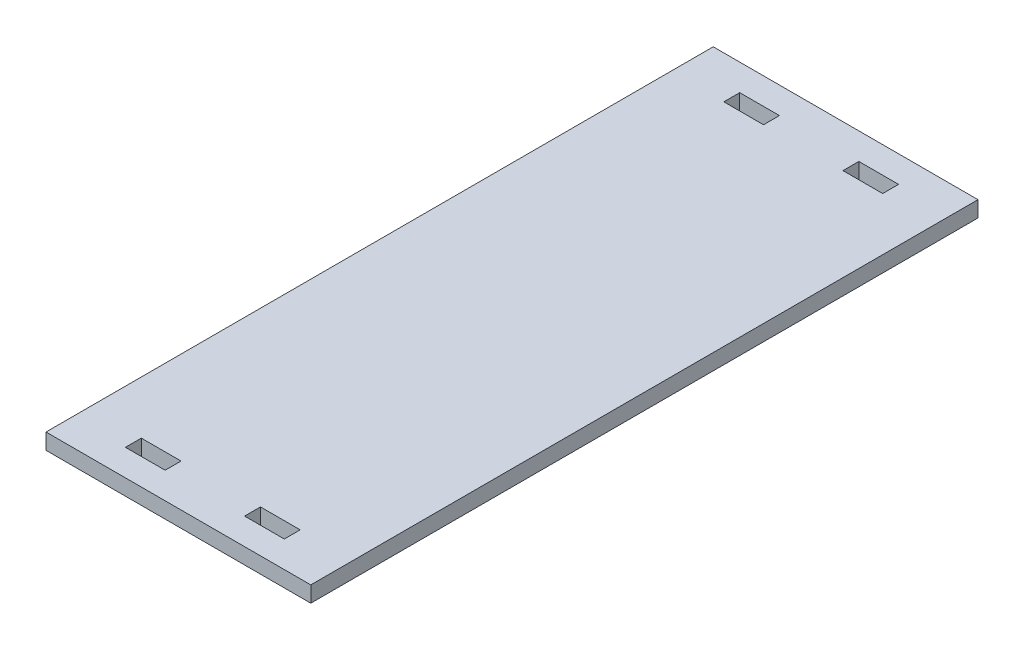
ISO-10303-21;
HEADER;
FILE_DESCRIPTION(('STEP AP214'),'2;1');
FILE_NAME('part.step','',(''),(''),'','','');
FILE_SCHEMA(('AUTOMOTIVE_DESIGN { 1 0 10303 214 1 1 1 1 }'));
ENDSEC;
DATA;
#1=APPLICATION_CONTEXT('core data for automotive mechanical design processes');
#2=APPLICATION_PROTOCOL_DEFINITION('international standard','automotive_design',2000,#1);
#3=PRODUCT_CONTEXT('',#1,'mechanical');
#4=PRODUCT('Part','Part','',(#3));
#5=PRODUCT_RELATED_PRODUCT_CATEGORY('part','',(#4));
#6=PRODUCT_DEFINITION_FORMATION('','',#4);
#7=PRODUCT_DEFINITION_CONTEXT('part definition',#1,'design');
#8=PRODUCT_DEFINITION('design','',#6,#7);
#9=PRODUCT_DEFINITION_SHAPE('','',#8);
#10=(LENGTH_UNIT() NAMED_UNIT(*) SI_UNIT(.MILLI.,.METRE.));
#11=(NAMED_UNIT(*) PLANE_ANGLE_UNIT() SI_UNIT($,.RADIAN.));
#12=(NAMED_UNIT(*) SI_UNIT($,.STERADIAN.) SOLID_ANGLE_UNIT());
#13=UNCERTAINTY_MEASURE_WITH_UNIT(LENGTH_MEASURE(1.E-05),#10,'distance_accuracy_value','');
#14=(GEOMETRIC_REPRESENTATION_CONTEXT(3) GLOBAL_UNCERTAINTY_ASSIGNED_CONTEXT((#13)) GLOBAL_UNIT_ASSIGNED_CONTEXT((#10,
#11,#12)) REPRESENTATION_CONTEXT('',''));
#15=CARTESIAN_POINT('',(0.,0.,0.));
#16=DIRECTION('',(0.,0.,1.));
#17=DIRECTION('',(1.,0.,0.));
#18=AXIS2_PLACEMENT_3D('',#15,#16,#17);
#19=CARTESIAN_POINT('',(0.,6.,0.));
#20=DIRECTION('',(0.,1.,0.));
#21=DIRECTION('',(0.,0.,1.));
#22=AXIS2_PLACEMENT_3D('',#19,#20,#21);
#23=PLANE('',#22);
#24=DIRECTION('',(0.,0.,-1.));
#25=VECTOR('',#24,1.);
#26=CARTESIAN_POINT('',(0.,6.,252.));
#27=LINE('',#26,#25);
#28=CARTESIAN_POINT('',(0.,6.,252.));
#29=VERTEX_POINT('',#28);
#30=CARTESIAN_POINT('',(0.,6.,0.));
#31=VERTEX_POINT('',#30);
#32=EDGE_CURVE('E360',#29,#31,#27,.T.);
#33=ORIENTED_EDGE('',*,*,#32,.T.);
#34=DIRECTION('',(-1.,0.,0.));
#35=VECTOR('',#34,1.);
#36=CARTESIAN_POINT('',(0.,6.,0.));
#37=LINE('',#36,#35);
#38=CARTESIAN_POINT('',(-100.,6.,0.));
#39=VERTEX_POINT('',#38);
#40=EDGE_CURVE('E364',#31,#39,#37,.T.);
#41=ORIENTED_EDGE('',*,*,#40,.T.);
#42=DIRECTION('',(0.,0.,1.));
#43=VECTOR('',#42,1.);
#44=CARTESIAN_POINT('',(-100.,6.,0.));
#45=LINE('',#44,#43);
#46=CARTESIAN_POINT('',(-100.,6.,252.));
#47=VERTEX_POINT('',#46);
#48=EDGE_CURVE('E368',#39,#47,#45,.T.);
#49=ORIENTED_EDGE('',*,*,#48,.T.);
#50=DIRECTION('',(1.,0.,0.));
#51=VECTOR('',#50,1.);
#52=CARTESIAN_POINT('',(-100.,6.,252.));
#53=LINE('',#52,#51);
#54=EDGE_CURVE('E371',#47,#29,#53,.T.);
#55=ORIENTED_EDGE('',*,*,#54,.T.);
#56=EDGE_LOOP('',(#33,#41,#49,#55));
#57=FACE_BOUND('',#56,.T.);
#58=DIRECTION('',(0.,0.,1.));
#59=VECTOR('',#58,1.);
#60=CARTESIAN_POINT('',(-80.,6.,10.));
#61=LINE('',#60,#59);
#62=CARTESIAN_POINT('',(-80.,6.,10.));
#63=VERTEX_POINT('',#62);
#64=CARTESIAN_POINT('',(-80.,6.,16.));
#65=VERTEX_POINT('',#64);
#66=EDGE_CURVE('E320',#63,#65,#61,.T.);
#67=ORIENTED_EDGE('',*,*,#66,.F.);
#68=DIRECTION('',(-1.,0.,0.));
#69=VECTOR('',#68,1.);
#70=CARTESIAN_POINT('',(-65.,6.,10.));
#71=LINE('',#70,#69);
#72=CARTESIAN_POINT('',(-65.,6.,10.));
#73=VERTEX_POINT('',#72);
#74=EDGE_CURVE('E317',#73,#63,#71,.T.);
#75=ORIENTED_EDGE('',*,*,#74,.F.);
#76=DIRECTION('',(0.,0.,-1.));
#77=VECTOR('',#76,1.);
#78=CARTESIAN_POINT('',(-65.,6.,10.));
#79=LINE('',#78,#77);
#80=CARTESIAN_POINT('',(-65.,6.,16.));
#81=VERTEX_POINT('',#80);
#82=EDGE_CURVE('E328',#81,#73,#79,.T.);
#83=ORIENTED_EDGE('',*,*,#82,.F.);
#84=DIRECTION('',(1.,0.,0.));
#85=VECTOR('',#84,1.);
#86=CARTESIAN_POINT('',(-80.,6.,16.));
#87=LINE('',#86,#85);
#88=EDGE_CURVE('E324',#65,#81,#87,.T.);
#89=ORIENTED_EDGE('',*,*,#88,.F.);
#90=EDGE_LOOP('',(#67,#75,#83,#89));
#91=FACE_BOUND('',#90,.T.);
#92=DIRECTION('',(0.,0.,-1.));
#93=VECTOR('',#92,1.);
#94=CARTESIAN_POINT('',(-20.,6.,10.));
#95=LINE('',#94,#93);
#96=CARTESIAN_POINT('',(-20.,6.,16.));
#97=VERTEX_POINT('',#96);
#98=CARTESIAN_POINT('',(-20.,6.,10.));
#99=VERTEX_POINT('',#98);
#100=EDGE_CURVE('E277',#97,#99,#95,.T.);
#101=ORIENTED_EDGE('',*,*,#100,.F.);
#102=DIRECTION('',(1.,0.,0.));
#103=VECTOR('',#102,1.);
#104=CARTESIAN_POINT('',(-20.,6.,16.));
#105=LINE('',#104,#103);
#106=CARTESIAN_POINT('',(-35.,6.,16.));
#107=VERTEX_POINT('',#106);
#108=EDGE_CURVE('E274',#107,#97,#105,.T.);
#109=ORIENTED_EDGE('',*,*,#108,.F.);
#110=DIRECTION('',(0.,0.,1.));
#111=VECTOR('',#110,1.);
#112=CARTESIAN_POINT('',(-35.,6.,16.));
#113=LINE('',#112,#111);
#114=CARTESIAN_POINT('',(-35.,6.,10.));
#115=VERTEX_POINT('',#114);
#116=EDGE_CURVE('E285',#115,#107,#113,.T.);
#117=ORIENTED_EDGE('',*,*,#116,.F.);
#118=DIRECTION('',(-1.,0.,0.));
#119=VECTOR('',#118,1.);
#120=CARTESIAN_POINT('',(-35.,6.,10.));
#121=LINE('',#120,#119);
#122=EDGE_CURVE('E281',#99,#115,#121,.T.);
#123=ORIENTED_EDGE('',*,*,#122,.F.);
#124=EDGE_LOOP('',(#101,#109,#117,#123));
#125=FACE_BOUND('',#124,.T.);
#126=DIRECTION('',(1.,0.,0.));
#127=VECTOR('',#126,1.);
#128=CARTESIAN_POINT('',(-80.,6.,242.000000000012));
#129=LINE('',#128,#127);
#130=CARTESIAN_POINT('',(-80.,6.,242.000000000012));
#131=VERTEX_POINT('',#130);
#132=CARTESIAN_POINT('',(-65.,6.,242.000000000012));
#133=VERTEX_POINT('',#132);
#134=EDGE_CURVE('E234',#131,#133,#129,.T.);
#135=ORIENTED_EDGE('',*,*,#134,.F.);
#136=DIRECTION('',(0.,0.,1.));
#137=VECTOR('',#136,1.);
#138=CARTESIAN_POINT('',(-80.,6.,236.000000000012));
#139=LINE('',#138,#137);
#140=CARTESIAN_POINT('',(-80.,6.,236.000000000012));
#141=VERTEX_POINT('',#140);
#142=EDGE_CURVE('E231',#141,#131,#139,.T.);
#143=ORIENTED_EDGE('',*,*,#142,.F.);
#144=DIRECTION('',(-1.,0.,0.));
#145=VECTOR('',#144,1.);
#146=CARTESIAN_POINT('',(-65.,6.,236.000000000012));
#147=LINE('',#146,#145);
#148=CARTESIAN_POINT('',(-65.,6.,236.000000000012));
#149=VERTEX_POINT('',#148);
#150=EDGE_CURVE('E242',#149,#141,#147,.T.);
#151=ORIENTED_EDGE('',*,*,#150,.F.);
#152=DIRECTION('',(0.,0.,-1.));
#153=VECTOR('',#152,1.);
#154=CARTESIAN_POINT('',(-65.,6.,236.000000000012));
#155=LINE('',#154,#153);
#156=EDGE_CURVE('E238',#133,#149,#155,.T.);
#157=ORIENTED_EDGE('',*,*,#156,.F.);
#158=EDGE_LOOP('',(#135,#143,#151,#157));
#159=FACE_BOUND('',#158,.T.);
#160=DIRECTION('',(0.,0.,-1.));
#161=VECTOR('',#160,1.);
#162=CARTESIAN_POINT('',(-20.,6.,236.000000000012));
#163=LINE('',#162,#161);
#164=CARTESIAN_POINT('',(-20.,6.,242.000000000012));
#165=VERTEX_POINT('',#164);
#166=CARTESIAN_POINT('',(-20.,6.,236.000000000012));
#167=VERTEX_POINT('',#166);
#168=EDGE_CURVE('E192',#165,#167,#163,.T.);
#169=ORIENTED_EDGE('',*,*,#168,.F.);
#170=DIRECTION('',(1.,0.,0.));
#171=VECTOR('',#170,1.);
#172=CARTESIAN_POINT('',(-20.,6.,242.000000000012));
#173=LINE('',#172,#171);
#174=CARTESIAN_POINT('',(-35.,6.,242.000000000012));
#175=VERTEX_POINT('',#174);
#176=EDGE_CURVE('E183',#175,#165,#173,.T.);
#177=ORIENTED_EDGE('',*,*,#176,.F.);
#178=DIRECTION('',(0.,0.,1.));
#179=VECTOR('',#178,1.);
#180=CARTESIAN_POINT('',(-35.,6.,242.000000000012));
#181=LINE('',#180,#179);
#182=CARTESIAN_POINT('',(-35.,6.,236.000000000012));
#183=VERTEX_POINT('',#182);
#184=EDGE_CURVE('E209',#183,#175,#181,.T.);
#185=ORIENTED_EDGE('',*,*,#184,.F.);
#186=DIRECTION('',(-1.,0.,0.));
#187=VECTOR('',#186,1.);
#188=CARTESIAN_POINT('',(-35.,6.,236.000000000012));
#189=LINE('',#188,#187);
#190=EDGE_CURVE('E205',#167,#183,#189,.T.);
#191=ORIENTED_EDGE('',*,*,#190,.F.);
#192=EDGE_LOOP('',(#169,#177,#185,#191));
#193=FACE_BOUND('',#192,.T.);
#194=ADVANCED_FACE('F45',(#57,#91,#125,#159,#193),#23,.T.);
#195=CARTESIAN_POINT('',(0.,0.,0.));
#196=DIRECTION('',(0.,1.,0.));
#197=DIRECTION('',(0.,0.,1.));
#198=AXIS2_PLACEMENT_3D('',#195,#196,#197);
#199=PLANE('',#198);
#200=DIRECTION('',(0.,0.,1.));
#201=VECTOR('',#200,1.);
#202=CARTESIAN_POINT('',(-80.,0.,236.000000000012));
#203=LINE('',#202,#201);
#204=CARTESIAN_POINT('',(-80.,0.,236.000000000012));
#205=VERTEX_POINT('',#204);
#206=CARTESIAN_POINT('',(-80.,0.,242.000000000012));
#207=VERTEX_POINT('',#206);
#208=EDGE_CURVE('E201',#205,#207,#203,.T.);
#209=ORIENTED_EDGE('',*,*,#208,.T.);
#210=DIRECTION('',(1.,0.,0.));
#211=VECTOR('',#210,1.);
#212=CARTESIAN_POINT('',(-80.,0.,242.000000000012));
#213=LINE('',#212,#211);
#214=CARTESIAN_POINT('',(-65.,0.,242.000000000012));
#215=VERTEX_POINT('',#214);
#216=EDGE_CURVE('E249',#207,#215,#213,.T.);
#217=ORIENTED_EDGE('',*,*,#216,.T.);
#218=DIRECTION('',(0.,0.,-1.));
#219=VECTOR('',#218,1.);
#220=CARTESIAN_POINT('',(-65.,0.,236.000000000012));
#221=LINE('',#220,#219);
#222=CARTESIAN_POINT('',(-65.,0.,236.000000000012));
#223=VERTEX_POINT('',#222);
#224=EDGE_CURVE('E253',#215,#223,#221,.T.);
#225=ORIENTED_EDGE('',*,*,#224,.T.);
#226=DIRECTION('',(-1.,0.,0.));
#227=VECTOR('',#226,1.);
#228=CARTESIAN_POINT('',(-65.,0.,236.000000000012));
#229=LINE('',#228,#227);
#230=EDGE_CURVE('E235',#223,#205,#229,.T.);
#231=ORIENTED_EDGE('',*,*,#230,.T.);
#232=EDGE_LOOP('',(#209,#217,#225,#231));
#233=FACE_BOUND('',#232,.T.);
#234=DIRECTION('',(-1.,0.,0.));
#235=VECTOR('',#234,1.);
#236=CARTESIAN_POINT('',(-65.,0.,10.));
#237=LINE('',#236,#235);
#238=CARTESIAN_POINT('',(-65.,0.,10.));
#239=VERTEX_POINT('',#238);
#240=CARTESIAN_POINT('',(-80.,0.,10.));
#241=VERTEX_POINT('',#240);
#242=EDGE_CURVE('E316',#239,#241,#237,.T.);
#243=ORIENTED_EDGE('',*,*,#242,.T.);
#244=DIRECTION('',(0.,0.,1.));
#245=VECTOR('',#244,1.);
#246=CARTESIAN_POINT('',(-80.,0.,10.));
#247=LINE('',#246,#245);
#248=CARTESIAN_POINT('',(-80.,0.,16.));
#249=VERTEX_POINT('',#248);
#250=EDGE_CURVE('E335',#241,#249,#247,.T.);
#251=ORIENTED_EDGE('',*,*,#250,.T.);
#252=DIRECTION('',(1.,0.,0.));
#253=VECTOR('',#252,1.);
#254=CARTESIAN_POINT('',(-80.,0.,16.));
#255=LINE('',#254,#253);
#256=CARTESIAN_POINT('',(-65.,0.,16.));
#257=VERTEX_POINT('',#256);
#258=EDGE_CURVE('E339',#249,#257,#255,.T.);
#259=ORIENTED_EDGE('',*,*,#258,.T.);
#260=DIRECTION('',(0.,0.,-1.));
#261=VECTOR('',#260,1.);
#262=CARTESIAN_POINT('',(-65.,0.,10.));
#263=LINE('',#262,#261);
#264=EDGE_CURVE('E321',#257,#239,#263,.T.);
#265=ORIENTED_EDGE('',*,*,#264,.T.);
#266=EDGE_LOOP('',(#243,#251,#259,#265));
#267=FACE_BOUND('',#266,.T.);
#268=DIRECTION('',(0.,0.,-1.));
#269=VECTOR('',#268,1.);
#270=CARTESIAN_POINT('',(0.,0.,252.));
#271=LINE('',#270,#269);
#272=CARTESIAN_POINT('',(0.,0.,252.));
#273=VERTEX_POINT('',#272);
#274=CARTESIAN_POINT('',(0.,0.,0.));
#275=VERTEX_POINT('',#274);
#276=EDGE_CURVE('E359',#273,#275,#271,.T.);
#277=ORIENTED_EDGE('',*,*,#276,.F.);
#278=DIRECTION('',(1.,0.,0.));
#279=VECTOR('',#278,1.);
#280=CARTESIAN_POINT('',(-100.,0.,252.));
#281=LINE('',#280,#279);
#282=CARTESIAN_POINT('',(-100.,0.,252.));
#283=VERTEX_POINT('',#282);
#284=EDGE_CURVE('E365',#283,#273,#281,.T.);
#285=ORIENTED_EDGE('',*,*,#284,.F.);
#286=DIRECTION('',(0.,0.,1.));
#287=VECTOR('',#286,1.);
#288=CARTESIAN_POINT('',(-100.,0.,0.));
#289=LINE('',#288,#287);
#290=CARTESIAN_POINT('',(-100.,0.,0.));
#291=VERTEX_POINT('',#290);
#292=EDGE_CURVE('E381',#291,#283,#289,.T.);
#293=ORIENTED_EDGE('',*,*,#292,.F.);
#294=DIRECTION('',(-1.,0.,0.));
#295=VECTOR('',#294,1.);
#296=CARTESIAN_POINT('',(0.,0.,0.));
#297=LINE('',#296,#295);
#298=EDGE_CURVE('E378',#275,#291,#297,.T.);
#299=ORIENTED_EDGE('',*,*,#298,.F.);
#300=EDGE_LOOP('',(#277,#285,#293,#299));
#301=FACE_BOUND('',#300,.T.);
#302=DIRECTION('',(1.,0.,0.));
#303=VECTOR('',#302,1.);
#304=CARTESIAN_POINT('',(-20.,0.,16.));
#305=LINE('',#304,#303);
#306=CARTESIAN_POINT('',(-35.,0.,16.));
#307=VERTEX_POINT('',#306);
#308=CARTESIAN_POINT('',(-20.,0.,16.));
#309=VERTEX_POINT('',#308);
#310=EDGE_CURVE('E273',#307,#309,#305,.T.);
#311=ORIENTED_EDGE('',*,*,#310,.T.);
#312=DIRECTION('',(0.,0.,-1.));
#313=VECTOR('',#312,1.);
#314=CARTESIAN_POINT('',(-20.,0.,10.));
#315=LINE('',#314,#313);
#316=CARTESIAN_POINT('',(-20.,0.,10.));
#317=VERTEX_POINT('',#316);
#318=EDGE_CURVE('E292',#309,#317,#315,.T.);
#319=ORIENTED_EDGE('',*,*,#318,.T.);
#320=DIRECTION('',(-1.,0.,0.));
#321=VECTOR('',#320,1.);
#322=CARTESIAN_POINT('',(-35.,0.,10.));
#323=LINE('',#322,#321);
#324=CARTESIAN_POINT('',(-35.,0.,10.));
#325=VERTEX_POINT('',#324);
#326=EDGE_CURVE('E296',#317,#325,#323,.T.);
#327=ORIENTED_EDGE('',*,*,#326,.T.);
#328=DIRECTION('',(0.,0.,1.));
#329=VECTOR('',#328,1.);
#330=CARTESIAN_POINT('',(-35.,0.,16.));
#331=LINE('',#330,#329);
#332=EDGE_CURVE('E278',#325,#307,#331,.T.);
#333=ORIENTED_EDGE('',*,*,#332,.T.);
#334=EDGE_LOOP('',(#311,#319,#327,#333));
#335=FACE_BOUND('',#334,.T.);
#336=DIRECTION('',(1.,0.,0.));
#337=VECTOR('',#336,1.);
#338=CARTESIAN_POINT('',(-20.,0.,242.000000000012));
#339=LINE('',#338,#337);
#340=CARTESIAN_POINT('',(-35.,0.,242.000000000012));
#341=VERTEX_POINT('',#340);
#342=CARTESIAN_POINT('',(-20.,0.,242.000000000012));
#343=VERTEX_POINT('',#342);
#344=EDGE_CURVE('E69',#341,#343,#339,.T.);
#345=ORIENTED_EDGE('',*,*,#344,.T.);
#346=DIRECTION('',(0.,0.,-1.));
#347=VECTOR('',#346,1.);
#348=CARTESIAN_POINT('',(-20.,0.,236.000000000012));
#349=LINE('',#348,#347);
#350=CARTESIAN_POINT('',(-20.,0.,236.000000000012));
#351=VERTEX_POINT('',#350);
#352=EDGE_CURVE('E199',#343,#351,#349,.T.);
#353=ORIENTED_EDGE('',*,*,#352,.T.);
#354=DIRECTION('',(-1.,0.,0.));
#355=VECTOR('',#354,1.);
#356=CARTESIAN_POINT('',(-35.,0.,236.000000000012));
#357=LINE('',#356,#355);
#358=CARTESIAN_POINT('',(-35.,0.,236.000000000012));
#359=VERTEX_POINT('',#358);
#360=EDGE_CURVE('E218',#351,#359,#357,.T.);
#361=ORIENTED_EDGE('',*,*,#360,.T.);
#362=DIRECTION('',(0.,0.,1.));
#363=VECTOR('',#362,1.);
#364=CARTESIAN_POINT('',(-35.,0.,242.000000000012));
#365=LINE('',#364,#363);
#366=EDGE_CURVE('E193',#359,#341,#365,.T.);
#367=ORIENTED_EDGE('',*,*,#366,.T.);
#368=EDGE_LOOP('',(#345,#353,#361,#367));
#369=FACE_BOUND('',#368,.T.);
#370=ADVANCED_FACE('F404',(#233,#267,#301,#335,#369),#199,.F.);
#371=CARTESIAN_POINT('',(0.,6.,252.));
#372=DIRECTION('',(-1.,0.,0.));
#373=DIRECTION('',(0.,0.,1.));
#374=AXIS2_PLACEMENT_3D('',#371,#372,#373);
#375=PLANE('',#374);
#376=ORIENTED_EDGE('',*,*,#276,.T.);
#377=DIRECTION('',(0.,-1.,0.));
#378=VECTOR('',#377,1.);
#379=CARTESIAN_POINT('',(0.,6.,0.));
#380=LINE('',#379,#378);
#381=EDGE_CURVE('E11',#31,#275,#380,.T.);
#382=ORIENTED_EDGE('',*,*,#381,.F.);
#383=ORIENTED_EDGE('',*,*,#32,.F.);
#384=DIRECTION('',(0.,-1.,0.));
#385=VECTOR('',#384,1.);
#386=CARTESIAN_POINT('',(0.,6.,252.));
#387=LINE('',#386,#385);
#388=EDGE_CURVE('E374',#29,#273,#387,.T.);
#389=ORIENTED_EDGE('',*,*,#388,.T.);
#390=EDGE_LOOP('',(#376,#382,#383,#389));
#391=FACE_BOUND('',#390,.T.);
#392=ADVANCED_FACE('F47',(#391),#375,.F.);
#393=CARTESIAN_POINT('',(0.,6.,0.));
#394=DIRECTION('',(0.,0.,1.));
#395=DIRECTION('',(1.,0.,0.));
#396=AXIS2_PLACEMENT_3D('',#393,#394,#395);
#397=PLANE('',#396);
#398=ORIENTED_EDGE('',*,*,#298,.T.);
#399=DIRECTION('',(0.,-1.,0.));
#400=VECTOR('',#399,1.);
#401=CARTESIAN_POINT('',(-100.,6.,0.));
#402=LINE('',#401,#400);
#403=EDGE_CURVE('E54',#39,#291,#402,.T.);
#404=ORIENTED_EDGE('',*,*,#403,.F.);
#405=ORIENTED_EDGE('',*,*,#40,.F.);
#406=ORIENTED_EDGE('',*,*,#381,.T.);
#407=EDGE_LOOP('',(#398,#404,#405,#406));
#408=FACE_BOUND('',#407,.T.);
#409=ADVANCED_FACE('F415',(#408),#397,.F.);
#410=CARTESIAN_POINT('',(-100.,6.,0.));
#411=DIRECTION('',(1.,0.,0.));
#412=DIRECTION('',(0.,0.,-1.));
#413=AXIS2_PLACEMENT_3D('',#410,#411,#412);
#414=PLANE('',#413);
#415=ORIENTED_EDGE('',*,*,#292,.T.);
#416=DIRECTION('',(0.,-1.,0.));
#417=VECTOR('',#416,1.);
#418=CARTESIAN_POINT('',(-100.,6.,252.));
#419=LINE('',#418,#417);
#420=EDGE_CURVE('E389',#47,#283,#419,.T.);
#421=ORIENTED_EDGE('',*,*,#420,.F.);
#422=ORIENTED_EDGE('',*,*,#48,.F.);
#423=ORIENTED_EDGE('',*,*,#403,.T.);
#424=EDGE_LOOP('',(#415,#421,#422,#423));
#425=FACE_BOUND('',#424,.T.);
#426=ADVANCED_FACE('F398',(#425),#414,.F.);
#427=CARTESIAN_POINT('',(-100.,6.,252.));
#428=DIRECTION('',(0.,0.,-1.));
#429=DIRECTION('',(-1.,0.,0.));
#430=AXIS2_PLACEMENT_3D('',#427,#428,#429);
#431=PLANE('',#430);
#432=ORIENTED_EDGE('',*,*,#284,.T.);
#433=ORIENTED_EDGE('',*,*,#388,.F.);
#434=ORIENTED_EDGE('',*,*,#54,.F.);
#435=ORIENTED_EDGE('',*,*,#420,.T.);
#436=EDGE_LOOP('',(#432,#433,#434,#435));
#437=FACE_BOUND('',#436,.T.);
#438=ADVANCED_FACE('F408',(#437),#431,.F.);
#439=CARTESIAN_POINT('',(-65.,6.,10.));
#440=DIRECTION('',(0.,0.,1.));
#441=DIRECTION('',(1.,0.,0.));
#442=AXIS2_PLACEMENT_3D('',#439,#440,#441);
#443=PLANE('',#442);
#444=ORIENTED_EDGE('',*,*,#242,.F.);
#445=DIRECTION('',(0.,-1.,0.));
#446=VECTOR('',#445,1.);
#447=CARTESIAN_POINT('',(-65.,6.,10.));
#448=LINE('',#447,#446);
#449=EDGE_CURVE('E331',#73,#239,#448,.T.);
#450=ORIENTED_EDGE('',*,*,#449,.F.);
#451=ORIENTED_EDGE('',*,*,#74,.T.);
#452=DIRECTION('',(0.,-1.,0.));
#453=VECTOR('',#452,1.);
#454=CARTESIAN_POINT('',(-80.,6.,10.));
#455=LINE('',#454,#453);
#456=EDGE_CURVE('E355',#63,#241,#455,.T.);
#457=ORIENTED_EDGE('',*,*,#456,.T.);
#458=EDGE_LOOP('',(#444,#450,#451,#457));
#459=FACE_BOUND('',#458,.T.);
#460=ADVANCED_FACE('F430',(#459),#443,.T.);
#461=CARTESIAN_POINT('',(-80.,6.,10.));
#462=DIRECTION('',(1.,0.,0.));
#463=DIRECTION('',(0.,0.,-1.));
#464=AXIS2_PLACEMENT_3D('',#461,#462,#463);
#465=PLANE('',#464);
#466=ORIENTED_EDGE('',*,*,#250,.F.);
#467=ORIENTED_EDGE('',*,*,#456,.F.);
#468=ORIENTED_EDGE('',*,*,#66,.T.);
#469=DIRECTION('',(0.,-1.,0.));
#470=VECTOR('',#469,1.);
#471=CARTESIAN_POINT('',(-80.,6.,16.));
#472=LINE('',#471,#470);
#473=EDGE_CURVE('E352',#65,#249,#472,.T.);
#474=ORIENTED_EDGE('',*,*,#473,.T.);
#475=EDGE_LOOP('',(#466,#467,#468,#474));
#476=FACE_BOUND('',#475,.T.);
#477=ADVANCED_FACE('F437',(#476),#465,.T.);
#478=CARTESIAN_POINT('',(-80.,6.,16.));
#479=DIRECTION('',(0.,0.,-1.));
#480=DIRECTION('',(-1.,0.,0.));
#481=AXIS2_PLACEMENT_3D('',#478,#479,#480);
#482=PLANE('',#481);
#483=ORIENTED_EDGE('',*,*,#258,.F.);
#484=ORIENTED_EDGE('',*,*,#473,.F.);
#485=ORIENTED_EDGE('',*,*,#88,.T.);
#486=DIRECTION('',(0.,-1.,0.));
#487=VECTOR('',#486,1.);
#488=CARTESIAN_POINT('',(-65.,6.,16.));
#489=LINE('',#488,#487);
#490=EDGE_CURVE('E349',#81,#257,#489,.T.);
#491=ORIENTED_EDGE('',*,*,#490,.T.);
#492=EDGE_LOOP('',(#483,#484,#485,#491));
#493=FACE_BOUND('',#492,.T.);
#494=ADVANCED_FACE('F442',(#493),#482,.T.);
#495=CARTESIAN_POINT('',(-65.,6.,10.));
#496=DIRECTION('',(-1.,0.,0.));
#497=DIRECTION('',(0.,0.,1.));
#498=AXIS2_PLACEMENT_3D('',#495,#496,#497);
#499=PLANE('',#498);
#500=ORIENTED_EDGE('',*,*,#264,.F.);
#501=ORIENTED_EDGE('',*,*,#490,.F.);
#502=ORIENTED_EDGE('',*,*,#82,.T.);
#503=ORIENTED_EDGE('',*,*,#449,.T.);
#504=EDGE_LOOP('',(#500,#501,#502,#503));
#505=FACE_BOUND('',#504,.T.);
#506=ADVANCED_FACE('F450',(#505),#499,.T.);
#507=CARTESIAN_POINT('',(-20.,6.,16.));
#508=DIRECTION('',(0.,0.,-1.));
#509=DIRECTION('',(-1.,0.,0.));
#510=AXIS2_PLACEMENT_3D('',#507,#508,#509);
#511=PLANE('',#510);
#512=ORIENTED_EDGE('',*,*,#310,.F.);
#513=DIRECTION('',(0.,-1.,0.));
#514=VECTOR('',#513,1.);
#515=CARTESIAN_POINT('',(-35.,6.,16.));
#516=LINE('',#515,#514);
#517=EDGE_CURVE('E288',#107,#307,#516,.T.);
#518=ORIENTED_EDGE('',*,*,#517,.F.);
#519=ORIENTED_EDGE('',*,*,#108,.T.);
#520=DIRECTION('',(0.,-1.,0.));
#521=VECTOR('',#520,1.);
#522=CARTESIAN_POINT('',(-20.,6.,16.));
#523=LINE('',#522,#521);
#524=EDGE_CURVE('E312',#97,#309,#523,.T.);
#525=ORIENTED_EDGE('',*,*,#524,.T.);
#526=EDGE_LOOP('',(#512,#518,#519,#525));
#527=FACE_BOUND('',#526,.T.);
#528=ADVANCED_FACE('F504',(#527),#511,.T.);
#529=CARTESIAN_POINT('',(-20.,6.,10.));
#530=DIRECTION('',(-1.,0.,0.));
#531=DIRECTION('',(0.,0.,1.));
#532=AXIS2_PLACEMENT_3D('',#529,#530,#531);
#533=PLANE('',#532);
#534=ORIENTED_EDGE('',*,*,#318,.F.);
#535=ORIENTED_EDGE('',*,*,#524,.F.);
#536=ORIENTED_EDGE('',*,*,#100,.T.);
#537=DIRECTION('',(0.,-1.,0.));
#538=VECTOR('',#537,1.);
#539=CARTESIAN_POINT('',(-20.,6.,10.));
#540=LINE('',#539,#538);
#541=EDGE_CURVE('E309',#99,#317,#540,.T.);
#542=ORIENTED_EDGE('',*,*,#541,.T.);
#543=EDGE_LOOP('',(#534,#535,#536,#542));
#544=FACE_BOUND('',#543,.T.);
#545=ADVANCED_FACE('F500',(#544),#533,.T.);
#546=CARTESIAN_POINT('',(-35.,6.,10.));
#547=DIRECTION('',(0.,0.,1.));
#548=DIRECTION('',(1.,0.,0.));
#549=AXIS2_PLACEMENT_3D('',#546,#547,#548);
#550=PLANE('',#549);
#551=ORIENTED_EDGE('',*,*,#326,.F.);
#552=ORIENTED_EDGE('',*,*,#541,.F.);
#553=ORIENTED_EDGE('',*,*,#122,.T.);
#554=DIRECTION('',(0.,-1.,0.));
#555=VECTOR('',#554,1.);
#556=CARTESIAN_POINT('',(-35.,6.,10.));
#557=LINE('',#556,#555);
#558=EDGE_CURVE('E306',#115,#325,#557,.T.);
#559=ORIENTED_EDGE('',*,*,#558,.T.);
#560=EDGE_LOOP('',(#551,#552,#553,#559));
#561=FACE_BOUND('',#560,.T.);
#562=ADVANCED_FACE('F496',(#561),#550,.T.);
#563=CARTESIAN_POINT('',(-35.,6.,16.));
#564=DIRECTION('',(1.,0.,0.));
#565=DIRECTION('',(0.,0.,-1.));
#566=AXIS2_PLACEMENT_3D('',#563,#564,#565);
#567=PLANE('',#566);
#568=ORIENTED_EDGE('',*,*,#332,.F.);
#569=ORIENTED_EDGE('',*,*,#558,.F.);
#570=ORIENTED_EDGE('',*,*,#116,.T.);
#571=ORIENTED_EDGE('',*,*,#517,.T.);
#572=EDGE_LOOP('',(#568,#569,#570,#571));
#573=FACE_BOUND('',#572,.T.);
#574=ADVANCED_FACE('F493',(#573),#567,.T.);
#575=CARTESIAN_POINT('',(-80.,6.,236.000000000012));
#576=DIRECTION('',(1.,0.,0.));
#577=DIRECTION('',(0.,0.,-1.));
#578=AXIS2_PLACEMENT_3D('',#575,#576,#577);
#579=PLANE('',#578);
#580=ORIENTED_EDGE('',*,*,#208,.F.);
#581=DIRECTION('',(0.,-1.,0.));
#582=VECTOR('',#581,1.);
#583=CARTESIAN_POINT('',(-80.,6.,236.000000000012));
#584=LINE('',#583,#582);
#585=EDGE_CURVE('E245',#141,#205,#584,.T.);
#586=ORIENTED_EDGE('',*,*,#585,.F.);
#587=ORIENTED_EDGE('',*,*,#142,.T.);
#588=DIRECTION('',(0.,-1.,0.));
#589=VECTOR('',#588,1.);
#590=CARTESIAN_POINT('',(-80.,6.,242.000000000012));
#591=LINE('',#590,#589);
#592=EDGE_CURVE('E269',#131,#207,#591,.T.);
#593=ORIENTED_EDGE('',*,*,#592,.T.);
#594=EDGE_LOOP('',(#580,#586,#587,#593));
#595=FACE_BOUND('',#594,.T.);
#596=ADVANCED_FACE('F475',(#595),#579,.T.);
#597=CARTESIAN_POINT('',(-80.,6.,242.000000000012));
#598=DIRECTION('',(0.,0.,-1.));
#599=DIRECTION('',(-1.,0.,0.));
#600=AXIS2_PLACEMENT_3D('',#597,#598,#599);
#601=PLANE('',#600);
#602=ORIENTED_EDGE('',*,*,#216,.F.);
#603=ORIENTED_EDGE('',*,*,#592,.F.);
#604=ORIENTED_EDGE('',*,*,#134,.T.);
#605=DIRECTION('',(0.,-1.,0.));
#606=VECTOR('',#605,1.);
#607=CARTESIAN_POINT('',(-65.,6.,242.000000000012));
#608=LINE('',#607,#606);
#609=EDGE_CURVE('E266',#133,#215,#608,.T.);
#610=ORIENTED_EDGE('',*,*,#609,.T.);
#611=EDGE_LOOP('',(#602,#603,#604,#610));
#612=FACE_BOUND('',#611,.T.);
#613=ADVANCED_FACE('F469',(#612),#601,.T.);
#614=CARTESIAN_POINT('',(-65.,6.,236.000000000012));
#615=DIRECTION('',(-1.,0.,0.));
#616=DIRECTION('',(0.,0.,1.));
#617=AXIS2_PLACEMENT_3D('',#614,#615,#616);
#618=PLANE('',#617);
#619=ORIENTED_EDGE('',*,*,#224,.F.);
#620=ORIENTED_EDGE('',*,*,#609,.F.);
#621=ORIENTED_EDGE('',*,*,#156,.T.);
#622=DIRECTION('',(0.,-1.,0.));
#623=VECTOR('',#622,1.);
#624=CARTESIAN_POINT('',(-65.,6.,236.000000000012));
#625=LINE('',#624,#623);
#626=EDGE_CURVE('E263',#149,#223,#625,.T.);
#627=ORIENTED_EDGE('',*,*,#626,.T.);
#628=EDGE_LOOP('',(#619,#620,#621,#627));
#629=FACE_BOUND('',#628,.T.);
#630=ADVANCED_FACE('F472',(#629),#618,.T.);
#631=CARTESIAN_POINT('',(-65.,6.,236.000000000012));
#632=DIRECTION('',(0.,0.,1.));
#633=DIRECTION('',(1.,0.,0.));
#634=AXIS2_PLACEMENT_3D('',#631,#632,#633);
#635=PLANE('',#634);
#636=ORIENTED_EDGE('',*,*,#230,.F.);
#637=ORIENTED_EDGE('',*,*,#626,.F.);
#638=ORIENTED_EDGE('',*,*,#150,.T.);
#639=ORIENTED_EDGE('',*,*,#585,.T.);
#640=EDGE_LOOP('',(#636,#637,#638,#639));
#641=FACE_BOUND('',#640,.T.);
#642=ADVANCED_FACE('F478',(#641),#635,.T.);
#643=CARTESIAN_POINT('',(-20.,6.,242.000000000012));
#644=DIRECTION('',(0.,0.,-1.));
#645=DIRECTION('',(-1.,0.,0.));
#646=AXIS2_PLACEMENT_3D('',#643,#644,#645);
#647=PLANE('',#646);
#648=ORIENTED_EDGE('',*,*,#344,.F.);
#649=DIRECTION('',(0.,-1.,0.));
#650=VECTOR('',#649,1.);
#651=CARTESIAN_POINT('',(-35.,6.,242.000000000012));
#652=LINE('',#651,#650);
#653=EDGE_CURVE('E187',#175,#341,#652,.T.);
#654=ORIENTED_EDGE('',*,*,#653,.F.);
#655=ORIENTED_EDGE('',*,*,#176,.T.);
#656=DIRECTION('',(0.,-1.,0.));
#657=VECTOR('',#656,1.);
#658=CARTESIAN_POINT('',(-20.,6.,242.000000000012));
#659=LINE('',#658,#657);
#660=EDGE_CURVE('E186',#165,#343,#659,.T.);
#661=ORIENTED_EDGE('',*,*,#660,.T.);
#662=EDGE_LOOP('',(#648,#654,#655,#661));
#663=FACE_BOUND('',#662,.T.);
#664=ADVANCED_FACE('F185',(#663),#647,.T.);
#665=CARTESIAN_POINT('',(-20.,6.,236.000000000012));
#666=DIRECTION('',(-1.,0.,0.));
#667=DIRECTION('',(0.,0.,1.));
#668=AXIS2_PLACEMENT_3D('',#665,#666,#667);
#669=PLANE('',#668);
#670=ORIENTED_EDGE('',*,*,#352,.F.);
#671=ORIENTED_EDGE('',*,*,#660,.F.);
#672=ORIENTED_EDGE('',*,*,#168,.T.);
#673=DIRECTION('',(0.,-1.,0.));
#674=VECTOR('',#673,1.);
#675=CARTESIAN_POINT('',(-20.,6.,236.000000000012));
#676=LINE('',#675,#674);
#677=EDGE_CURVE('E202',#167,#351,#676,.T.);
#678=ORIENTED_EDGE('',*,*,#677,.T.);
#679=EDGE_LOOP('',(#670,#671,#672,#678));
#680=FACE_BOUND('',#679,.T.);
#681=ADVANCED_FACE('F196',(#680),#669,.T.);
#682=CARTESIAN_POINT('',(-35.,6.,236.000000000012));
#683=DIRECTION('',(0.,0.,1.));
#684=DIRECTION('',(1.,0.,0.));
#685=AXIS2_PLACEMENT_3D('',#682,#683,#684);
#686=PLANE('',#685);
#687=ORIENTED_EDGE('',*,*,#360,.F.);
#688=ORIENTED_EDGE('',*,*,#677,.F.);
#689=ORIENTED_EDGE('',*,*,#190,.T.);
#690=DIRECTION('',(0.,-1.,0.));
#691=VECTOR('',#690,1.);
#692=CARTESIAN_POINT('',(-35.,6.,236.000000000012));
#693=LINE('',#692,#691);
#694=EDGE_CURVE('E61',#183,#359,#693,.T.);
#695=ORIENTED_EDGE('',*,*,#694,.T.);
#696=EDGE_LOOP('',(#687,#688,#689,#695));
#697=FACE_BOUND('',#696,.T.);
#698=ADVANCED_FACE('F576',(#697),#686,.T.);
#699=CARTESIAN_POINT('',(-35.,6.,242.000000000012));
#700=DIRECTION('',(1.,0.,0.));
#701=DIRECTION('',(0.,0.,-1.));
#702=AXIS2_PLACEMENT_3D('',#699,#700,#701);
#703=PLANE('',#702);
#704=ORIENTED_EDGE('',*,*,#366,.F.);
#705=ORIENTED_EDGE('',*,*,#694,.F.);
#706=ORIENTED_EDGE('',*,*,#184,.T.);
#707=ORIENTED_EDGE('',*,*,#653,.T.);
#708=EDGE_LOOP('',(#704,#705,#706,#707));
#709=FACE_BOUND('',#708,.T.);
#710=ADVANCED_FACE('F584',(#709),#703,.T.);
#711=CLOSED_SHELL('',(#194,#370,#392,#409,#426,#438,#460,#477,#494,#506,#528,#545,#562,#574,
#596,#613,#630,#642,#664,#681,#698,#710));
#712=MANIFOLD_SOLID_BREP('B2',#711);
#713=ADVANCED_BREP_SHAPE_REPRESENTATION('',(#18,#712),#14);
#714=SHAPE_DEFINITION_REPRESENTATION(#9,#713);
ENDSEC;
END-ISO-10303-21;
